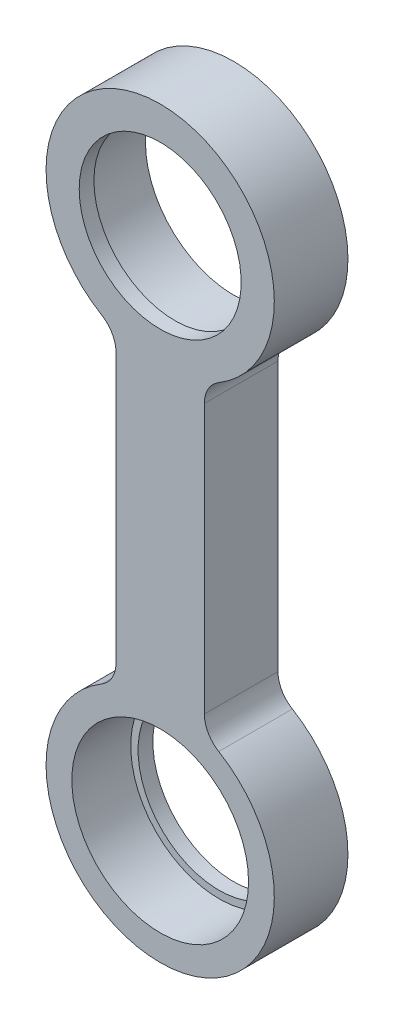
ISO-10303-21;
HEADER;
FILE_DESCRIPTION(('STEP AP214'),'2;1');
FILE_NAME('part.step','',(''),(''),'','','');
FILE_SCHEMA(('AUTOMOTIVE_DESIGN { 1 0 10303 214 1 1 1 1 }'));
ENDSEC;
DATA;
#1=APPLICATION_CONTEXT('core data for automotive mechanical design processes');
#2=APPLICATION_PROTOCOL_DEFINITION('international standard','automotive_design',2000,#1);
#3=PRODUCT_CONTEXT('',#1,'mechanical');
#4=PRODUCT('Part','Part','',(#3));
#5=PRODUCT_RELATED_PRODUCT_CATEGORY('part','',(#4));
#6=PRODUCT_DEFINITION_FORMATION('','',#4);
#7=PRODUCT_DEFINITION_CONTEXT('part definition',#1,'design');
#8=PRODUCT_DEFINITION('design','',#6,#7);
#9=PRODUCT_DEFINITION_SHAPE('','',#8);
#10=(LENGTH_UNIT() NAMED_UNIT(*) SI_UNIT(.MILLI.,.METRE.));
#11=(NAMED_UNIT(*) PLANE_ANGLE_UNIT() SI_UNIT($,.RADIAN.));
#12=(NAMED_UNIT(*) SI_UNIT($,.STERADIAN.) SOLID_ANGLE_UNIT());
#13=UNCERTAINTY_MEASURE_WITH_UNIT(LENGTH_MEASURE(1.E-05),#10,'distance_accuracy_value','');
#14=(GEOMETRIC_REPRESENTATION_CONTEXT(3) GLOBAL_UNCERTAINTY_ASSIGNED_CONTEXT((#13)) GLOBAL_UNIT_ASSIGNED_CONTEXT((#10,
#11,#12)) REPRESENTATION_CONTEXT('',''));
#15=CARTESIAN_POINT('',(0.,0.,0.));
#16=DIRECTION('',(0.,0.,1.));
#17=DIRECTION('',(1.,0.,0.));
#18=AXIS2_PLACEMENT_3D('',#15,#16,#17);
#19=CARTESIAN_POINT('',(0.,35.,5.));
#20=DIRECTION('',(0.,0.,-1.));
#21=DIRECTION('',(-1.,0.,0.));
#22=AXIS2_PLACEMENT_3D('',#19,#20,#21);
#23=CYLINDRICAL_SURFACE('',#22,7.75);
#24=CARTESIAN_POINT('',(0.,35.,0.));
#25=DIRECTION('',(0.,0.,-1.));
#26=DIRECTION('',(-1.,0.,0.));
#27=AXIS2_PLACEMENT_3D('',#24,#25,#26);
#28=CIRCLE('',#27,7.75);
#29=CARTESIAN_POINT('',(-3.97435897435897,28.3466571753041,0.));
#30=VERTEX_POINT('',#29);
#31=CARTESIAN_POINT('',(3.97435897435897,28.3466571753041,0.));
#32=VERTEX_POINT('',#31);
#33=EDGE_CURVE('E177',#30,#32,#28,.T.);
#34=ORIENTED_EDGE('',*,*,#33,.F.);
#35=DIRECTION('',(0.,0.,-1.));
#36=VECTOR('',#35,1.);
#37=CARTESIAN_POINT('',(-3.97435897435897,28.3466571753041,5.));
#38=LINE('',#37,#36);
#39=CARTESIAN_POINT('',(-3.97435897435897,28.3466571753041,5.));
#40=VERTEX_POINT('',#39);
#41=EDGE_CURVE('E138',#30,#40,#38,.F.);
#42=ORIENTED_EDGE('',*,*,#41,.T.);
#43=CARTESIAN_POINT('',(0.,35.,5.));
#44=DIRECTION('',(0.,0.,-1.));
#45=DIRECTION('',(-1.,0.,0.));
#46=AXIS2_PLACEMENT_3D('',#43,#44,#45);
#47=CIRCLE('',#46,7.75);
#48=CARTESIAN_POINT('',(3.97435897435897,28.3466571753041,5.));
#49=VERTEX_POINT('',#48);
#50=EDGE_CURVE('E125',#40,#49,#47,.T.);
#51=ORIENTED_EDGE('',*,*,#50,.T.);
#52=DIRECTION('',(0.,0.,-1.));
#53=VECTOR('',#52,1.);
#54=CARTESIAN_POINT('',(3.97435897435897,28.3466571753041,5.));
#55=LINE('',#54,#53);
#56=EDGE_CURVE('E130',#49,#32,#55,.T.);
#57=ORIENTED_EDGE('',*,*,#56,.T.);
#58=EDGE_LOOP('',(#34,#42,#51,#57));
#59=FACE_BOUND('',#58,.T.);
#60=ADVANCED_FACE('F41',(#59),#23,.T.);
#61=CARTESIAN_POINT('',(-3.,7.14580296397823,5.));
#62=DIRECTION('',(-1.,0.,0.));
#63=DIRECTION('',(0.,0.,1.));
#64=AXIS2_PLACEMENT_3D('',#61,#62,#63);
#65=PLANE('',#64);
#66=DIRECTION('',(0.,1.,0.));
#67=VECTOR('',#66,1.);
#68=CARTESIAN_POINT('',(-3.,7.14580296397823,5.));
#69=LINE('',#68,#67);
#70=CARTESIAN_POINT('',(-3.,8.3703345213916,5.));
#71=VERTEX_POINT('',#70);
#72=CARTESIAN_POINT('',(-3.,26.6296654786084,5.));
#73=VERTEX_POINT('',#72);
#74=EDGE_CURVE('E128',#71,#73,#69,.T.);
#75=ORIENTED_EDGE('',*,*,#74,.T.);
#76=DIRECTION('',(0.,0.,1.));
#77=VECTOR('',#76,1.);
#78=CARTESIAN_POINT('',(-3.,26.6296654786084,0.));
#79=LINE('',#78,#77);
#80=CARTESIAN_POINT('',(-3.,26.6296654786084,0.));
#81=VERTEX_POINT('',#80);
#82=EDGE_CURVE('E124',#73,#81,#79,.F.);
#83=ORIENTED_EDGE('',*,*,#82,.T.);
#84=DIRECTION('',(0.,1.,0.));
#85=VECTOR('',#84,1.);
#86=CARTESIAN_POINT('',(-3.,7.14580296397823,0.));
#87=LINE('',#86,#85);
#88=CARTESIAN_POINT('',(-3.,8.3703345213916,0.));
#89=VERTEX_POINT('',#88);
#90=EDGE_CURVE('E110',#89,#81,#87,.T.);
#91=ORIENTED_EDGE('',*,*,#90,.F.);
#92=DIRECTION('',(0.,0.,1.));
#93=VECTOR('',#92,1.);
#94=CARTESIAN_POINT('',(-3.,8.3703345213916,5.));
#95=LINE('',#94,#93);
#96=EDGE_CURVE('E122',#89,#71,#95,.T.);
#97=ORIENTED_EDGE('',*,*,#96,.T.);
#98=EDGE_LOOP('',(#75,#83,#91,#97));
#99=FACE_BOUND('',#98,.T.);
#100=ADVANCED_FACE('F121',(#99),#65,.T.);
#101=CARTESIAN_POINT('',(0.,0.,5.));
#102=DIRECTION('',(0.,0.,-1.));
#103=DIRECTION('',(-1.,0.,0.));
#104=AXIS2_PLACEMENT_3D('',#101,#102,#103);
#105=CYLINDRICAL_SURFACE('',#104,7.75);
#106=CARTESIAN_POINT('',(0.,0.,5.));
#107=DIRECTION('',(0.,0.,-1.));
#108=DIRECTION('',(-1.,0.,0.));
#109=AXIS2_PLACEMENT_3D('',#106,#107,#108);
#110=CIRCLE('',#109,7.75);
#111=CARTESIAN_POINT('',(3.97435897435898,6.65334282469589,5.));
#112=VERTEX_POINT('',#111);
#113=CARTESIAN_POINT('',(-3.97435897435898,6.65334282469589,5.));
#114=VERTEX_POINT('',#113);
#115=EDGE_CURVE('E132',#112,#114,#110,.T.);
#116=ORIENTED_EDGE('',*,*,#115,.T.);
#117=DIRECTION('',(0.,0.,-1.));
#118=VECTOR('',#117,1.);
#119=CARTESIAN_POINT('',(-3.97435897435897,6.65334282469589,5.));
#120=LINE('',#119,#118);
#121=CARTESIAN_POINT('',(-3.97435897435898,6.65334282469589,0.));
#122=VERTEX_POINT('',#121);
#123=EDGE_CURVE('E146',#114,#122,#120,.T.);
#124=ORIENTED_EDGE('',*,*,#123,.T.);
#125=CARTESIAN_POINT('',(0.,0.,0.));
#126=DIRECTION('',(0.,0.,-1.));
#127=DIRECTION('',(-1.,0.,0.));
#128=AXIS2_PLACEMENT_3D('',#125,#126,#127);
#129=CIRCLE('',#128,7.75);
#130=CARTESIAN_POINT('',(3.97435897435898,6.65334282469589,0.));
#131=VERTEX_POINT('',#130);
#132=EDGE_CURVE('E111',#131,#122,#129,.T.);
#133=ORIENTED_EDGE('',*,*,#132,.F.);
#134=DIRECTION('',(0.,0.,-1.));
#135=VECTOR('',#134,1.);
#136=CARTESIAN_POINT('',(3.97435897435897,6.65334282469589,5.));
#137=LINE('',#136,#135);
#138=EDGE_CURVE('E63',#131,#112,#137,.F.);
#139=ORIENTED_EDGE('',*,*,#138,.T.);
#140=EDGE_LOOP('',(#116,#124,#133,#139));
#141=FACE_BOUND('',#140,.T.);
#142=ADVANCED_FACE('F160',(#141),#105,.T.);
#143=CARTESIAN_POINT('',(3.,27.8541970360218,5.));
#144=DIRECTION('',(1.,0.,0.));
#145=DIRECTION('',(0.,0.,-1.));
#146=AXIS2_PLACEMENT_3D('',#143,#144,#145);
#147=PLANE('',#146);
#148=DIRECTION('',(0.,-1.,0.));
#149=VECTOR('',#148,1.);
#150=CARTESIAN_POINT('',(3.,27.8541970360218,0.));
#151=LINE('',#150,#149);
#152=CARTESIAN_POINT('',(3.,26.6296654786084,0.));
#153=VERTEX_POINT('',#152);
#154=CARTESIAN_POINT('',(3.,8.3703345213916,0.));
#155=VERTEX_POINT('',#154);
#156=EDGE_CURVE('E157',#153,#155,#151,.T.);
#157=ORIENTED_EDGE('',*,*,#156,.F.);
#158=DIRECTION('',(0.,0.,1.));
#159=VECTOR('',#158,1.);
#160=CARTESIAN_POINT('',(3.,26.6296654786084,5.));
#161=LINE('',#160,#159);
#162=CARTESIAN_POINT('',(3.,26.6296654786084,5.));
#163=VERTEX_POINT('',#162);
#164=EDGE_CURVE('E143',#153,#163,#161,.T.);
#165=ORIENTED_EDGE('',*,*,#164,.T.);
#166=DIRECTION('',(0.,-1.,0.));
#167=VECTOR('',#166,1.);
#168=CARTESIAN_POINT('',(3.,27.8541970360218,5.));
#169=LINE('',#168,#167);
#170=CARTESIAN_POINT('',(3.,8.3703345213916,5.));
#171=VERTEX_POINT('',#170);
#172=EDGE_CURVE('E166',#163,#171,#169,.T.);
#173=ORIENTED_EDGE('',*,*,#172,.T.);
#174=DIRECTION('',(0.,0.,1.));
#175=VECTOR('',#174,1.);
#176=CARTESIAN_POINT('',(3.,8.3703345213916,0.));
#177=LINE('',#176,#175);
#178=EDGE_CURVE('E140',#171,#155,#177,.F.);
#179=ORIENTED_EDGE('',*,*,#178,.T.);
#180=EDGE_LOOP('',(#157,#165,#173,#179));
#181=FACE_BOUND('',#180,.T.);
#182=ADVANCED_FACE('F169',(#181),#147,.T.);
#183=CARTESIAN_POINT('',(0.,35.,5.));
#184=DIRECTION('',(0.,0.,-1.));
#185=DIRECTION('',(-1.,0.,0.));
#186=AXIS2_PLACEMENT_3D('',#183,#184,#185);
#187=PLANE('',#186);
#188=CARTESIAN_POINT('',(0.,0.,5.));
#189=DIRECTION('',(0.,0.,1.));
#190=DIRECTION('',(1.,0.,0.));
#191=AXIS2_PLACEMENT_3D('',#188,#189,#190);
#192=CIRCLE('',#191,5.99999999999999);
#193=CARTESIAN_POINT('',(5.99999999999999,0.,5.));
#194=VERTEX_POINT('',#193);
#195=EDGE_CURVE('E204',#194,#194,#192,.T.);
#196=ORIENTED_EDGE('',*,*,#195,.F.);
#197=EDGE_LOOP('',(#196));
#198=FACE_BOUND('',#197,.T.);
#199=CARTESIAN_POINT('',(0.,35.,5.));
#200=DIRECTION('',(0.,0.,-1.));
#201=DIRECTION('',(-1.,0.,0.));
#202=AXIS2_PLACEMENT_3D('',#199,#200,#201);
#203=CIRCLE('',#202,5.50000000000001);
#204=CARTESIAN_POINT('',(-5.50000000000001,35.,5.));
#205=VERTEX_POINT('',#204);
#206=EDGE_CURVE('E180',#205,#205,#203,.T.);
#207=ORIENTED_EDGE('',*,*,#206,.T.);
#208=EDGE_LOOP('',(#207));
#209=FACE_BOUND('',#208,.T.);
#210=ORIENTED_EDGE('',*,*,#50,.F.);
#211=CARTESIAN_POINT('',(-5.,26.6296654786084,5.));
#212=DIRECTION('',(0.,0.,-1.));
#213=DIRECTION('',(-1.,0.,0.));
#214=AXIS2_PLACEMENT_3D('',#211,#212,#213);
#215=CIRCLE('',#214,2.);
#216=EDGE_CURVE('E150',#40,#73,#215,.T.);
#217=ORIENTED_EDGE('',*,*,#216,.T.);
#218=ORIENTED_EDGE('',*,*,#74,.F.);
#219=CARTESIAN_POINT('',(-5.,8.3703345213916,5.));
#220=DIRECTION('',(0.,0.,-1.));
#221=DIRECTION('',(-1.,0.,0.));
#222=AXIS2_PLACEMENT_3D('',#219,#220,#221);
#223=CIRCLE('',#222,2.);
#224=EDGE_CURVE('E56',#71,#114,#223,.T.);
#225=ORIENTED_EDGE('',*,*,#224,.T.);
#226=ORIENTED_EDGE('',*,*,#115,.F.);
#227=CARTESIAN_POINT('',(5.,8.3703345213916,5.));
#228=DIRECTION('',(0.,0.,-1.));
#229=DIRECTION('',(-1.,0.,0.));
#230=AXIS2_PLACEMENT_3D('',#227,#228,#229);
#231=CIRCLE('',#230,2.);
#232=EDGE_CURVE('E11',#112,#171,#231,.T.);
#233=ORIENTED_EDGE('',*,*,#232,.T.);
#234=ORIENTED_EDGE('',*,*,#172,.F.);
#235=CARTESIAN_POINT('',(5.,26.6296654786084,5.));
#236=DIRECTION('',(0.,0.,-1.));
#237=DIRECTION('',(-1.,0.,0.));
#238=AXIS2_PLACEMENT_3D('',#235,#236,#237);
#239=CIRCLE('',#238,2.);
#240=EDGE_CURVE('E116',#163,#49,#239,.T.);
#241=ORIENTED_EDGE('',*,*,#240,.T.);
#242=EDGE_LOOP('',(#210,#217,#218,#225,#226,#233,#234,#241));
#243=FACE_BOUND('',#242,.T.);
#244=ADVANCED_FACE('F165',(#198,#209,#243),#187,.F.);
#245=CARTESIAN_POINT('',(0.,35.,0.));
#246=DIRECTION('',(0.,0.,-1.));
#247=DIRECTION('',(-1.,0.,0.));
#248=AXIS2_PLACEMENT_3D('',#245,#246,#247);
#249=PLANE('',#248);
#250=CARTESIAN_POINT('',(0.,0.,0.));
#251=DIRECTION('',(0.,0.,1.));
#252=DIRECTION('',(1.,0.,0.));
#253=AXIS2_PLACEMENT_3D('',#250,#251,#252);
#254=CIRCLE('',#253,5.50000000000001);
#255=CARTESIAN_POINT('',(5.50000000000001,0.,0.));
#256=VERTEX_POINT('',#255);
#257=EDGE_CURVE('E195',#256,#256,#254,.T.);
#258=ORIENTED_EDGE('',*,*,#257,.T.);
#259=EDGE_LOOP('',(#258));
#260=FACE_BOUND('',#259,.T.);
#261=CARTESIAN_POINT('',(0.,35.,0.));
#262=DIRECTION('',(0.,0.,-1.));
#263=DIRECTION('',(-1.,0.,0.));
#264=AXIS2_PLACEMENT_3D('',#261,#262,#263);
#265=CIRCLE('',#264,5.99999999999999);
#266=CARTESIAN_POINT('',(-5.99999999999999,35.,0.));
#267=VERTEX_POINT('',#266);
#268=EDGE_CURVE('E192',#267,#267,#265,.T.);
#269=ORIENTED_EDGE('',*,*,#268,.F.);
#270=EDGE_LOOP('',(#269));
#271=FACE_BOUND('',#270,.T.);
#272=ORIENTED_EDGE('',*,*,#90,.T.);
#273=CARTESIAN_POINT('',(-5.,26.6296654786084,0.));
#274=DIRECTION('',(0.,0.,-1.));
#275=DIRECTION('',(-1.,0.,0.));
#276=AXIS2_PLACEMENT_3D('',#273,#274,#275);
#277=CIRCLE('',#276,2.);
#278=EDGE_CURVE('E148',#81,#30,#277,.F.);
#279=ORIENTED_EDGE('',*,*,#278,.T.);
#280=ORIENTED_EDGE('',*,*,#33,.T.);
#281=CARTESIAN_POINT('',(5.,26.6296654786084,0.));
#282=DIRECTION('',(0.,0.,-1.));
#283=DIRECTION('',(-1.,0.,0.));
#284=AXIS2_PLACEMENT_3D('',#281,#282,#283);
#285=CIRCLE('',#284,2.);
#286=EDGE_CURVE('E152',#32,#153,#285,.F.);
#287=ORIENTED_EDGE('',*,*,#286,.T.);
#288=ORIENTED_EDGE('',*,*,#156,.T.);
#289=CARTESIAN_POINT('',(5.,8.3703345213916,0.));
#290=DIRECTION('',(0.,0.,-1.));
#291=DIRECTION('',(-1.,0.,0.));
#292=AXIS2_PLACEMENT_3D('',#289,#290,#291);
#293=CIRCLE('',#292,2.);
#294=EDGE_CURVE('E49',#155,#131,#293,.F.);
#295=ORIENTED_EDGE('',*,*,#294,.T.);
#296=ORIENTED_EDGE('',*,*,#132,.T.);
#297=CARTESIAN_POINT('',(-5.,8.3703345213916,0.));
#298=DIRECTION('',(0.,0.,-1.));
#299=DIRECTION('',(-1.,0.,0.));
#300=AXIS2_PLACEMENT_3D('',#297,#298,#299);
#301=CIRCLE('',#300,2.);
#302=EDGE_CURVE('E107',#122,#89,#301,.F.);
#303=ORIENTED_EDGE('',*,*,#302,.T.);
#304=EDGE_LOOP('',(#272,#279,#280,#287,#288,#295,#296,#303));
#305=FACE_BOUND('',#304,.T.);
#306=ADVANCED_FACE('F109',(#260,#271,#305),#249,.T.);
#307=CARTESIAN_POINT('',(0.,35.,0.));
#308=DIRECTION('',(0.,0.,-1.));
#309=DIRECTION('',(-1.,0.,0.));
#310=AXIS2_PLACEMENT_3D('',#307,#308,#309);
#311=CYLINDRICAL_SURFACE('',#310,5.50000000000001);
#312=ORIENTED_EDGE('',*,*,#206,.F.);
#313=EDGE_LOOP('',(#312));
#314=FACE_BOUND('',#313,.T.);
#315=CARTESIAN_POINT('',(0.,35.,4.));
#316=DIRECTION('',(0.,0.,-1.));
#317=DIRECTION('',(-1.,0.,0.));
#318=AXIS2_PLACEMENT_3D('',#315,#316,#317);
#319=CIRCLE('',#318,5.50000000000001);
#320=CARTESIAN_POINT('',(-5.50000000000001,35.,4.));
#321=VERTEX_POINT('',#320);
#322=EDGE_CURVE('E183',#321,#321,#319,.T.);
#323=ORIENTED_EDGE('',*,*,#322,.T.);
#324=EDGE_LOOP('',(#323));
#325=FACE_BOUND('',#324,.T.);
#326=ADVANCED_FACE('F216',(#314,#325),#311,.F.);
#327=CARTESIAN_POINT('',(5.50000000000001,35.,4.));
#328=DIRECTION('',(0.,0.,1.));
#329=DIRECTION('',(1.,0.,0.));
#330=AXIS2_PLACEMENT_3D('',#327,#328,#329);
#331=PLANE('',#330);
#332=ORIENTED_EDGE('',*,*,#322,.F.);
#333=EDGE_LOOP('',(#332));
#334=FACE_BOUND('',#333,.T.);
#335=CARTESIAN_POINT('',(0.,35.,4.));
#336=DIRECTION('',(0.,0.,-1.));
#337=DIRECTION('',(-1.,0.,0.));
#338=AXIS2_PLACEMENT_3D('',#335,#336,#337);
#339=CIRCLE('',#338,5.99999999999999);
#340=CARTESIAN_POINT('',(-5.99999999999999,35.,4.));
#341=VERTEX_POINT('',#340);
#342=EDGE_CURVE('E187',#341,#341,#339,.T.);
#343=ORIENTED_EDGE('',*,*,#342,.T.);
#344=EDGE_LOOP('',(#343));
#345=FACE_BOUND('',#344,.T.);
#346=ADVANCED_FACE('F299',(#334,#345),#331,.F.);
#347=CARTESIAN_POINT('',(0.,35.,0.));
#348=DIRECTION('',(0.,0.,-1.));
#349=DIRECTION('',(-1.,0.,0.));
#350=AXIS2_PLACEMENT_3D('',#347,#348,#349);
#351=CYLINDRICAL_SURFACE('',#350,5.99999999999999);
#352=ORIENTED_EDGE('',*,*,#342,.F.);
#353=EDGE_LOOP('',(#352));
#354=FACE_BOUND('',#353,.T.);
#355=ORIENTED_EDGE('',*,*,#268,.T.);
#356=EDGE_LOOP('',(#355));
#357=FACE_BOUND('',#356,.T.);
#358=ADVANCED_FACE('F289',(#354,#357),#351,.F.);
#359=CARTESIAN_POINT('',(0.,0.,5.));
#360=DIRECTION('',(0.,0.,1.));
#361=DIRECTION('',(1.,0.,0.));
#362=AXIS2_PLACEMENT_3D('',#359,#360,#361);
#363=CYLINDRICAL_SURFACE('',#362,5.50000000000001);
#364=ORIENTED_EDGE('',*,*,#257,.F.);
#365=EDGE_LOOP('',(#364));
#366=FACE_BOUND('',#365,.T.);
#367=CARTESIAN_POINT('',(0.,0.,1.));
#368=DIRECTION('',(0.,0.,1.));
#369=DIRECTION('',(1.,0.,0.));
#370=AXIS2_PLACEMENT_3D('',#367,#368,#369);
#371=CIRCLE('',#370,5.50000000000001);
#372=CARTESIAN_POINT('',(5.50000000000001,0.,1.));
#373=VERTEX_POINT('',#372);
#374=EDGE_CURVE('E198',#373,#373,#371,.T.);
#375=ORIENTED_EDGE('',*,*,#374,.T.);
#376=EDGE_LOOP('',(#375));
#377=FACE_BOUND('',#376,.T.);
#378=ADVANCED_FACE('F279',(#366,#377),#363,.F.);
#379=CARTESIAN_POINT('',(5.50000000000001,0.,1.));
#380=DIRECTION('',(0.,0.,-1.));
#381=DIRECTION('',(-1.,0.,0.));
#382=AXIS2_PLACEMENT_3D('',#379,#380,#381);
#383=PLANE('',#382);
#384=ORIENTED_EDGE('',*,*,#374,.F.);
#385=EDGE_LOOP('',(#384));
#386=FACE_BOUND('',#385,.T.);
#387=CARTESIAN_POINT('',(0.,0.,1.));
#388=DIRECTION('',(0.,0.,1.));
#389=DIRECTION('',(1.,0.,0.));
#390=AXIS2_PLACEMENT_3D('',#387,#388,#389);
#391=CIRCLE('',#390,5.99999999999999);
#392=CARTESIAN_POINT('',(5.99999999999999,0.,1.));
#393=VERTEX_POINT('',#392);
#394=EDGE_CURVE('E201',#393,#393,#391,.T.);
#395=ORIENTED_EDGE('',*,*,#394,.T.);
#396=EDGE_LOOP('',(#395));
#397=FACE_BOUND('',#396,.T.);
#398=ADVANCED_FACE('F269',(#386,#397),#383,.F.);
#399=CARTESIAN_POINT('',(0.,0.,5.));
#400=DIRECTION('',(0.,0.,1.));
#401=DIRECTION('',(1.,0.,0.));
#402=AXIS2_PLACEMENT_3D('',#399,#400,#401);
#403=CYLINDRICAL_SURFACE('',#402,5.99999999999999);
#404=ORIENTED_EDGE('',*,*,#394,.F.);
#405=EDGE_LOOP('',(#404));
#406=FACE_BOUND('',#405,.T.);
#407=ORIENTED_EDGE('',*,*,#195,.T.);
#408=EDGE_LOOP('',(#407));
#409=FACE_BOUND('',#408,.T.);
#410=ADVANCED_FACE('F208',(#406,#409),#403,.F.);
#411=CARTESIAN_POINT('',(-5.,26.6296654786084,5.));
#412=DIRECTION('',(0.,0.,-1.));
#413=DIRECTION('',(-1.,0.,0.));
#414=AXIS2_PLACEMENT_3D('',#411,#412,#413);
#415=CYLINDRICAL_SURFACE('',#414,2.);
#416=ORIENTED_EDGE('',*,*,#216,.F.);
#417=ORIENTED_EDGE('',*,*,#41,.F.);
#418=ORIENTED_EDGE('',*,*,#278,.F.);
#419=ORIENTED_EDGE('',*,*,#82,.F.);
#420=EDGE_LOOP('',(#416,#417,#418,#419));
#421=FACE_BOUND('',#420,.T.);
#422=ADVANCED_FACE('F231',(#421),#415,.F.);
#423=CARTESIAN_POINT('',(5.,26.6296654786084,5.));
#424=DIRECTION('',(0.,0.,-1.));
#425=DIRECTION('',(-1.,0.,0.));
#426=AXIS2_PLACEMENT_3D('',#423,#424,#425);
#427=CYLINDRICAL_SURFACE('',#426,2.);
#428=ORIENTED_EDGE('',*,*,#240,.F.);
#429=ORIENTED_EDGE('',*,*,#164,.F.);
#430=ORIENTED_EDGE('',*,*,#286,.F.);
#431=ORIENTED_EDGE('',*,*,#56,.F.);
#432=EDGE_LOOP('',(#428,#429,#430,#431));
#433=FACE_BOUND('',#432,.T.);
#434=ADVANCED_FACE('F234',(#433),#427,.F.);
#435=CARTESIAN_POINT('',(-5.,8.3703345213916,5.));
#436=DIRECTION('',(0.,0.,-1.));
#437=DIRECTION('',(-1.,0.,0.));
#438=AXIS2_PLACEMENT_3D('',#435,#436,#437);
#439=CYLINDRICAL_SURFACE('',#438,2.);
#440=ORIENTED_EDGE('',*,*,#224,.F.);
#441=ORIENTED_EDGE('',*,*,#96,.F.);
#442=ORIENTED_EDGE('',*,*,#302,.F.);
#443=ORIENTED_EDGE('',*,*,#123,.F.);
#444=EDGE_LOOP('',(#440,#441,#442,#443));
#445=FACE_BOUND('',#444,.T.);
#446=ADVANCED_FACE('F127',(#445),#439,.F.);
#447=CARTESIAN_POINT('',(5.,8.3703345213916,5.));
#448=DIRECTION('',(0.,0.,-1.));
#449=DIRECTION('',(-1.,0.,0.));
#450=AXIS2_PLACEMENT_3D('',#447,#448,#449);
#451=CYLINDRICAL_SURFACE('',#450,2.);
#452=ORIENTED_EDGE('',*,*,#232,.F.);
#453=ORIENTED_EDGE('',*,*,#138,.F.);
#454=ORIENTED_EDGE('',*,*,#294,.F.);
#455=ORIENTED_EDGE('',*,*,#178,.F.);
#456=EDGE_LOOP('',(#452,#453,#454,#455));
#457=FACE_BOUND('',#456,.T.);
#458=ADVANCED_FACE('F43',(#457),#451,.F.);
#459=CLOSED_SHELL('',(#60,#100,#142,#182,#244,#306,#326,#346,#358,#378,#398,#410,#422,#434,#446,#458));
#460=MANIFOLD_SOLID_BREP('B2',#459);
#461=ADVANCED_BREP_SHAPE_REPRESENTATION('',(#18,#460),#14);
#462=SHAPE_DEFINITION_REPRESENTATION(#9,#461);
ENDSEC;
END-ISO-10303-21;
